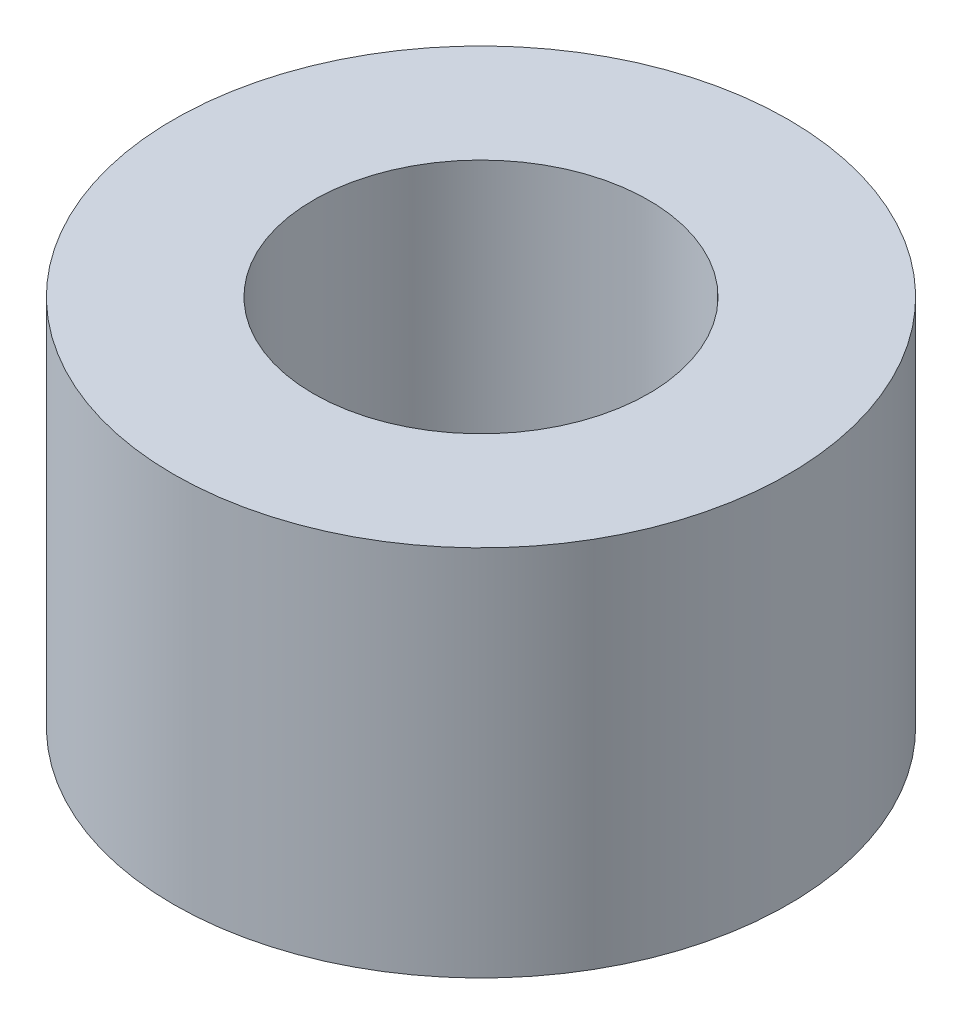
ISO-10303-21;
HEADER;
FILE_DESCRIPTION(('STEP AP214'),'2;1');
FILE_NAME('part.step','',(''),(''),'','','');
FILE_SCHEMA(('AUTOMOTIVE_DESIGN { 1 0 10303 214 1 1 1 1 }'));
ENDSEC;
DATA;
#1=APPLICATION_CONTEXT('core data for automotive mechanical design processes');
#2=APPLICATION_PROTOCOL_DEFINITION('international standard','automotive_design',2000,#1);
#3=PRODUCT_CONTEXT('',#1,'mechanical');
#4=PRODUCT('Part','Part','',(#3));
#5=PRODUCT_RELATED_PRODUCT_CATEGORY('part','',(#4));
#6=PRODUCT_DEFINITION_FORMATION('','',#4);
#7=PRODUCT_DEFINITION_CONTEXT('part definition',#1,'design');
#8=PRODUCT_DEFINITION('design','',#6,#7);
#9=PRODUCT_DEFINITION_SHAPE('','',#8);
#10=(LENGTH_UNIT() NAMED_UNIT(*) SI_UNIT(.MILLI.,.METRE.));
#11=(NAMED_UNIT(*) PLANE_ANGLE_UNIT() SI_UNIT($,.RADIAN.));
#12=(NAMED_UNIT(*) SI_UNIT($,.STERADIAN.) SOLID_ANGLE_UNIT());
#13=UNCERTAINTY_MEASURE_WITH_UNIT(LENGTH_MEASURE(1.E-05),#10,'distance_accuracy_value','');
#14=(GEOMETRIC_REPRESENTATION_CONTEXT(3) GLOBAL_UNCERTAINTY_ASSIGNED_CONTEXT((#13)) GLOBAL_UNIT_ASSIGNED_CONTEXT((#10,
#11,#12)) REPRESENTATION_CONTEXT('',''));
#15=CARTESIAN_POINT('',(0.,0.,0.));
#16=DIRECTION('',(0.,0.,1.));
#17=DIRECTION('',(1.,0.,0.));
#18=AXIS2_PLACEMENT_3D('',#15,#16,#17);
#19=CARTESIAN_POINT('',(0.,4.,0.));
#20=DIRECTION('',(0.,1.,0.));
#21=DIRECTION('',(0.,0.,1.));
#22=AXIS2_PLACEMENT_3D('',#19,#20,#21);
#23=PLANE('',#22);
#24=CARTESIAN_POINT('',(0.,4.,0.));
#25=DIRECTION('',(0.,1.,0.));
#26=DIRECTION('',(0.,0.,1.));
#27=AXIS2_PLACEMENT_3D('',#24,#25,#26);
#28=CIRCLE('',#27,3.3);
#29=CARTESIAN_POINT('',(0.,4.,3.3));
#30=VERTEX_POINT('',#29);
#31=EDGE_CURVE('E10',#30,#30,#28,.T.);
#32=ORIENTED_EDGE('',*,*,#31,.T.);
#33=EDGE_LOOP('',(#32));
#34=FACE_BOUND('',#33,.T.);
#35=CARTESIAN_POINT('',(0.,4.,0.));
#36=DIRECTION('',(0.,1.,0.));
#37=DIRECTION('',(0.,0.,1.));
#38=AXIS2_PLACEMENT_3D('',#35,#36,#37);
#39=CIRCLE('',#38,1.8);
#40=CARTESIAN_POINT('',(0.,4.,1.8));
#41=VERTEX_POINT('',#40);
#42=EDGE_CURVE('E42',#41,#41,#39,.T.);
#43=ORIENTED_EDGE('',*,*,#42,.F.);
#44=EDGE_LOOP('',(#43));
#45=FACE_BOUND('',#44,.T.);
#46=ADVANCED_FACE('F31',(#34,#45),#23,.T.);
#47=CARTESIAN_POINT('',(0.,0.,0.));
#48=DIRECTION('',(0.,1.,0.));
#49=DIRECTION('',(0.,0.,1.));
#50=AXIS2_PLACEMENT_3D('',#47,#48,#49);
#51=PLANE('',#50);
#52=CARTESIAN_POINT('',(0.,0.,0.));
#53=DIRECTION('',(0.,1.,0.));
#54=DIRECTION('',(0.,0.,1.));
#55=AXIS2_PLACEMENT_3D('',#52,#53,#54);
#56=CIRCLE('',#55,3.3);
#57=CARTESIAN_POINT('',(0.,0.,3.3));
#58=VERTEX_POINT('',#57);
#59=EDGE_CURVE('E35',#58,#58,#56,.T.);
#60=ORIENTED_EDGE('',*,*,#59,.F.);
#61=EDGE_LOOP('',(#60));
#62=FACE_BOUND('',#61,.T.);
#63=CARTESIAN_POINT('',(0.,0.,0.));
#64=DIRECTION('',(0.,1.,0.));
#65=DIRECTION('',(0.,0.,1.));
#66=AXIS2_PLACEMENT_3D('',#63,#64,#65);
#67=CIRCLE('',#66,1.8);
#68=CARTESIAN_POINT('',(0.,0.,1.8));
#69=VERTEX_POINT('',#68);
#70=EDGE_CURVE('E44',#69,#69,#67,.T.);
#71=ORIENTED_EDGE('',*,*,#70,.T.);
#72=EDGE_LOOP('',(#71));
#73=FACE_BOUND('',#72,.T.);
#74=ADVANCED_FACE('F54',(#62,#73),#51,.F.);
#75=CARTESIAN_POINT('',(0.,4.,0.));
#76=DIRECTION('',(0.,-1.,0.));
#77=DIRECTION('',(0.,0.,-1.));
#78=AXIS2_PLACEMENT_3D('',#75,#76,#77);
#79=CYLINDRICAL_SURFACE('',#78,3.3);
#80=ORIENTED_EDGE('',*,*,#31,.F.);
#81=EDGE_LOOP('',(#80));
#82=FACE_BOUND('',#81,.T.);
#83=ORIENTED_EDGE('',*,*,#59,.T.);
#84=EDGE_LOOP('',(#83));
#85=FACE_BOUND('',#84,.T.);
#86=ADVANCED_FACE('F33',(#82,#85),#79,.T.);
#87=CARTESIAN_POINT('',(0.,4.,0.));
#88=DIRECTION('',(0.,-1.,0.));
#89=DIRECTION('',(0.,0.,-1.));
#90=AXIS2_PLACEMENT_3D('',#87,#88,#89);
#91=CYLINDRICAL_SURFACE('',#90,1.8);
#92=ORIENTED_EDGE('',*,*,#42,.T.);
#93=EDGE_LOOP('',(#92));
#94=FACE_BOUND('',#93,.T.);
#95=ORIENTED_EDGE('',*,*,#70,.F.);
#96=EDGE_LOOP('',(#95));
#97=FACE_BOUND('',#96,.T.);
#98=ADVANCED_FACE('F50',(#94,#97),#91,.F.);
#99=CLOSED_SHELL('',(#46,#74,#86,#98));
#100=MANIFOLD_SOLID_BREP('B2',#99);
#101=ADVANCED_BREP_SHAPE_REPRESENTATION('',(#18,#100),#14);
#102=SHAPE_DEFINITION_REPRESENTATION(#9,#101);
ENDSEC;
END-ISO-10303-21;
